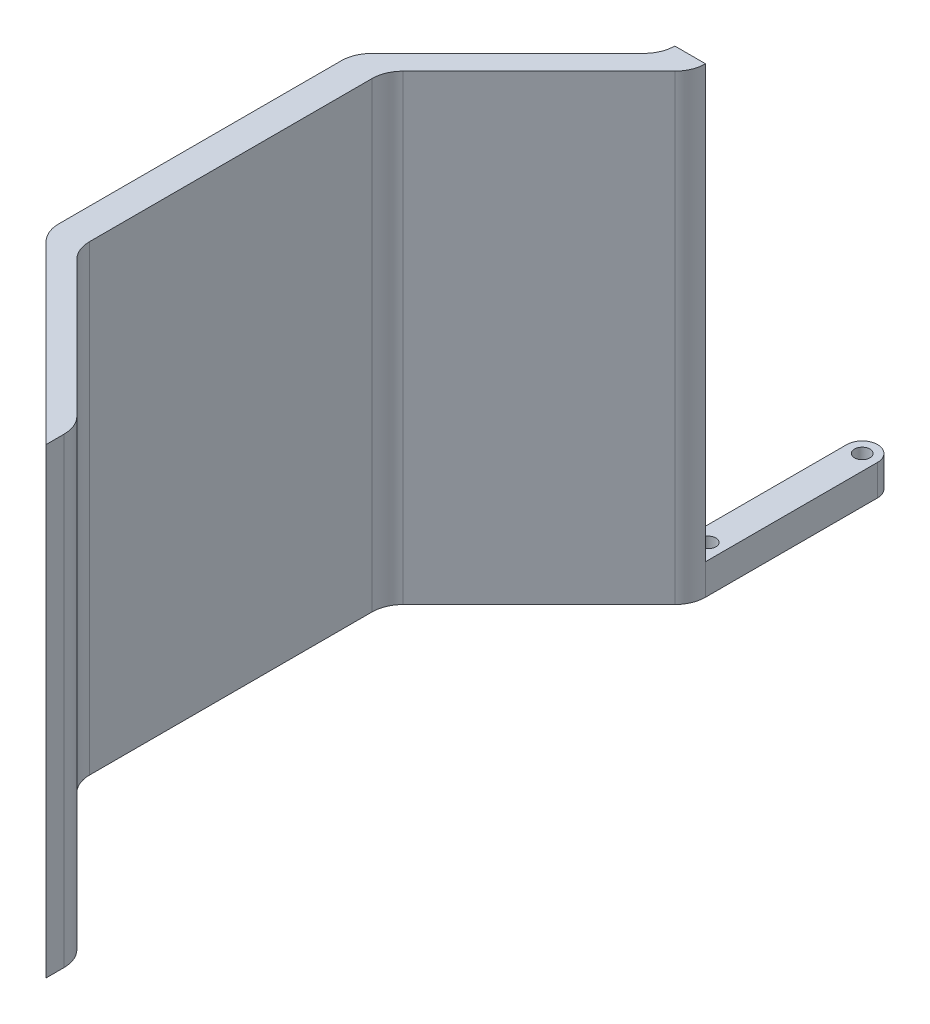
ISO-10303-21;
HEADER;
FILE_DESCRIPTION(('STEP AP214'),'2;1');
FILE_NAME('part.step','',(''),(''),'','','');
FILE_SCHEMA(('AUTOMOTIVE_DESIGN { 1 0 10303 214 1 1 1 1 }'));
ENDSEC;
DATA;
#1=APPLICATION_CONTEXT('core data for automotive mechanical design processes');
#2=APPLICATION_PROTOCOL_DEFINITION('international standard','automotive_design',2000,#1);
#3=PRODUCT_CONTEXT('',#1,'mechanical');
#4=PRODUCT('Part','Part','',(#3));
#5=PRODUCT_RELATED_PRODUCT_CATEGORY('part','',(#4));
#6=PRODUCT_DEFINITION_FORMATION('','',#4);
#7=PRODUCT_DEFINITION_CONTEXT('part definition',#1,'design');
#8=PRODUCT_DEFINITION('design','',#6,#7);
#9=PRODUCT_DEFINITION_SHAPE('','',#8);
#10=(LENGTH_UNIT() NAMED_UNIT(*) SI_UNIT(.MILLI.,.METRE.));
#11=(NAMED_UNIT(*) PLANE_ANGLE_UNIT() SI_UNIT($,.RADIAN.));
#12=(NAMED_UNIT(*) SI_UNIT($,.STERADIAN.) SOLID_ANGLE_UNIT());
#13=UNCERTAINTY_MEASURE_WITH_UNIT(LENGTH_MEASURE(1.E-05),#10,'distance_accuracy_value','');
#14=(GEOMETRIC_REPRESENTATION_CONTEXT(3) GLOBAL_UNCERTAINTY_ASSIGNED_CONTEXT((#13)) GLOBAL_UNIT_ASSIGNED_CONTEXT((#10,
#11,#12)) REPRESENTATION_CONTEXT('',''));
#15=CARTESIAN_POINT('',(0.,0.,0.));
#16=DIRECTION('',(0.,0.,1.));
#17=DIRECTION('',(1.,0.,0.));
#18=AXIS2_PLACEMENT_3D('',#15,#16,#17);
#19=CARTESIAN_POINT('',(-78.9293710518805,150.,-45.9986158011053));
#20=DIRECTION('',(0.,-1.,0.));
#21=DIRECTION('',(0.,0.,-1.));
#22=AXIS2_PLACEMENT_3D('',#19,#20,#21);
#23=CYLINDRICAL_SURFACE('',#22,5.);
#24=DIRECTION('',(0.,-1.,0.));
#25=VECTOR('',#24,1.);
#26=CARTESIAN_POINT('',(-83.9293710518805,150.,-45.9986158011053));
#27=LINE('',#26,#25);
#28=CARTESIAN_POINT('',(-83.9293710518805,9.99999999999998,-45.9986158011053));
#29=VERTEX_POINT('',#28);
#30=CARTESIAN_POINT('',(-83.9293710518805,0.,-45.9986158011053));
#31=VERTEX_POINT('',#30);
#32=EDGE_CURVE('E11',#29,#31,#27,.T.);
#33=ORIENTED_EDGE('',*,*,#32,.F.);
#34=CARTESIAN_POINT('',(-78.9293710518805,9.99999999999998,-45.9986158011053));
#35=DIRECTION('',(0.,1.,0.));
#36=DIRECTION('',(0.,0.,1.));
#37=AXIS2_PLACEMENT_3D('',#34,#35,#36);
#38=CIRCLE('',#37,5.);
#39=CARTESIAN_POINT('',(-73.9293710518805,9.99999999999998,-45.9986158011053));
#40=VERTEX_POINT('',#39);
#41=EDGE_CURVE('E204',#40,#29,#38,.T.);
#42=ORIENTED_EDGE('',*,*,#41,.F.);
#43=DIRECTION('',(0.,-1.,0.));
#44=VECTOR('',#43,1.);
#45=CARTESIAN_POINT('',(-73.9293710518805,150.,-45.9986158011053));
#46=LINE('',#45,#44);
#47=CARTESIAN_POINT('',(-73.9293710518805,0.,-45.9986158011053));
#48=VERTEX_POINT('',#47);
#49=EDGE_CURVE('E121',#40,#48,#46,.T.);
#50=ORIENTED_EDGE('',*,*,#49,.T.);
#51=CARTESIAN_POINT('',(-78.9293710518805,0.,-45.9986158011053));
#52=DIRECTION('',(0.,1.,0.));
#53=DIRECTION('',(0.,0.,1.));
#54=AXIS2_PLACEMENT_3D('',#51,#52,#53);
#55=CIRCLE('',#54,5.);
#56=EDGE_CURVE('E201',#31,#48,#55,.F.);
#57=ORIENTED_EDGE('',*,*,#56,.F.);
#58=EDGE_LOOP('',(#33,#42,#50,#57));
#59=FACE_BOUND('',#58,.T.);
#60=ADVANCED_FACE('F39',(#59),#23,.T.);
#61=CARTESIAN_POINT('',(-83.9293710518805,150.,0.));
#62=DIRECTION('',(1.,0.,0.));
#63=DIRECTION('',(0.,0.,-1.));
#64=AXIS2_PLACEMENT_3D('',#61,#62,#63);
#65=PLANE('',#64);
#66=DIRECTION('',(0.,0.,1.));
#67=VECTOR('',#66,1.);
#68=CARTESIAN_POINT('',(-83.9293710518805,9.99999999999998,-45.9986158011053));
#69=LINE('',#68,#67);
#70=CARTESIAN_POINT('',(-83.9293710518805,9.99999999999998,9.85924857516368));
#71=VERTEX_POINT('',#70);
#72=EDGE_CURVE('E290',#29,#71,#69,.T.);
#73=ORIENTED_EDGE('',*,*,#72,.F.);
#74=ORIENTED_EDGE('',*,*,#32,.T.);
#75=DIRECTION('',(0.,0.,1.));
#76=VECTOR('',#75,1.);
#77=CARTESIAN_POINT('',(-83.9293710518805,0.,0.));
#78=LINE('',#77,#76);
#79=CARTESIAN_POINT('',(-83.9293710518805,0.,9.85924857516368));
#80=VERTEX_POINT('',#79);
#81=EDGE_CURVE('E203',#31,#80,#78,.T.);
#82=ORIENTED_EDGE('',*,*,#81,.T.);
#83=DIRECTION('',(0.,-1.,0.));
#84=VECTOR('',#83,1.);
#85=CARTESIAN_POINT('',(-83.9293710518805,150.,9.85924857516368));
#86=LINE('',#85,#84);
#87=EDGE_CURVE('E274',#71,#80,#86,.T.);
#88=ORIENTED_EDGE('',*,*,#87,.F.);
#89=EDGE_LOOP('',(#73,#74,#82,#88));
#90=FACE_BOUND('',#89,.T.);
#91=ADVANCED_FACE('F348',(#90),#65,.F.);
#92=CARTESIAN_POINT('',(-73.9293710518805,150.,-3.50290159799378E-13));
#93=DIRECTION('',(1.,0.,0.));
#94=DIRECTION('',(0.,0.,-1.));
#95=AXIS2_PLACEMENT_3D('',#92,#93,#94);
#96=PLANE('',#95);
#97=ORIENTED_EDGE('',*,*,#49,.F.);
#98=DIRECTION('',(0.,0.,-1.));
#99=VECTOR('',#98,1.);
#100=CARTESIAN_POINT('',(-73.9293710518805,9.99999999999998,9.85924857516374));
#101=LINE('',#100,#99);
#102=CARTESIAN_POINT('',(-73.9293710518805,9.99999999999998,9.85924857516374));
#103=VERTEX_POINT('',#102);
#104=EDGE_CURVE('E296',#103,#40,#101,.T.);
#105=ORIENTED_EDGE('',*,*,#104,.F.);
#106=DIRECTION('',(0.,-1.,0.));
#107=VECTOR('',#106,1.);
#108=CARTESIAN_POINT('',(-73.9293710518805,150.,9.85924857516374));
#109=LINE('',#108,#107);
#110=CARTESIAN_POINT('',(-73.9293710518805,0.,9.85924857516374));
#111=VERTEX_POINT('',#110);
#112=EDGE_CURVE('E113',#103,#111,#109,.T.);
#113=ORIENTED_EDGE('',*,*,#112,.T.);
#114=DIRECTION('',(0.,0.,1.));
#115=VECTOR('',#114,1.);
#116=CARTESIAN_POINT('',(-73.9293710518805,0.,-3.50290159799378E-13));
#117=LINE('',#116,#115);
#118=EDGE_CURVE('E239',#48,#111,#117,.T.);
#119=ORIENTED_EDGE('',*,*,#118,.F.);
#120=EDGE_LOOP('',(#97,#105,#113,#119));
#121=FACE_BOUND('',#120,.T.);
#122=ADVANCED_FACE('F343',(#121),#96,.T.);
#123=CARTESIAN_POINT('',(-93.9293710518805,150.,9.85924857516369));
#124=DIRECTION('',(0.,-1.,0.));
#125=DIRECTION('',(0.,0.,-1.));
#126=AXIS2_PLACEMENT_3D('',#123,#124,#125);
#127=CYLINDRICAL_SURFACE('',#126,10.);
#128=CARTESIAN_POINT('',(-93.9293710518805,0.,9.85924857516369));
#129=DIRECTION('',(0.,1.,0.));
#130=DIRECTION('',(0.,0.,1.));
#131=AXIS2_PLACEMENT_3D('',#128,#129,#130);
#132=CIRCLE('',#131,10.);
#133=CARTESIAN_POINT('',(-86.8583032400151,0.,16.9303163870293));
#134=VERTEX_POINT('',#133);
#135=EDGE_CURVE('E207',#134,#80,#132,.T.);
#136=ORIENTED_EDGE('',*,*,#135,.F.);
#137=DIRECTION('',(0.,-1.,0.));
#138=VECTOR('',#137,1.);
#139=CARTESIAN_POINT('',(-86.8583032400151,150.,16.9303163870293));
#140=LINE('',#139,#138);
#141=CARTESIAN_POINT('',(-86.8583032400151,150.,16.9303163870293));
#142=VERTEX_POINT('',#141);
#143=EDGE_CURVE('E272',#142,#134,#140,.T.);
#144=ORIENTED_EDGE('',*,*,#143,.F.);
#145=CARTESIAN_POINT('',(-93.9293710518805,150.,9.85924857516369));
#146=DIRECTION('',(0.,1.,0.));
#147=DIRECTION('',(0.,0.,1.));
#148=AXIS2_PLACEMENT_3D('',#145,#146,#147);
#149=CIRCLE('',#148,10.);
#150=CARTESIAN_POINT('',(-83.9293710518805,150.,9.85924857516368));
#151=VERTEX_POINT('',#150);
#152=EDGE_CURVE('E242',#142,#151,#149,.T.);
#153=ORIENTED_EDGE('',*,*,#152,.T.);
#154=EDGE_CURVE('E48',#151,#71,#86,.T.);
#155=ORIENTED_EDGE('',*,*,#154,.T.);
#156=ORIENTED_EDGE('',*,*,#87,.T.);
#157=EDGE_LOOP('',(#136,#144,#153,#155,#156));
#158=FACE_BOUND('',#157,.T.);
#159=ADVANCED_FACE('F354',(#158),#127,.F.);
#160=CARTESIAN_POINT('',(-34.9639934264919,150.,-34.9639934264927));
#161=DIRECTION('',(0.707106781186539,0.,0.707106781186556));
#162=DIRECTION('',(0.707106781186556,0.,-0.707106781186539));
#163=AXIS2_PLACEMENT_3D('',#160,#161,#162);
#164=PLANE('',#163);
#165=DIRECTION('',(-0.707106781186556,0.,0.707106781186539));
#166=VECTOR('',#165,1.);
#167=CARTESIAN_POINT('',(-34.9639934264919,0.,-34.9639934264927));
#168=LINE('',#167,#166);
#169=CARTESIAN_POINT('',(-131.000438863747,0.,61.0724520107602));
#170=VERTEX_POINT('',#169);
#171=EDGE_CURVE('E210',#134,#170,#168,.T.);
#172=ORIENTED_EDGE('',*,*,#171,.T.);
#173=DIRECTION('',(0.,-1.,0.));
#174=VECTOR('',#173,1.);
#175=CARTESIAN_POINT('',(-131.000438863747,150.,61.0724520107602));
#176=LINE('',#175,#174);
#177=CARTESIAN_POINT('',(-131.000438863747,150.,61.0724520107602));
#178=VERTEX_POINT('',#177);
#179=EDGE_CURVE('E269',#178,#170,#176,.T.);
#180=ORIENTED_EDGE('',*,*,#179,.F.);
#181=DIRECTION('',(-0.707106781186556,0.,0.707106781186539));
#182=VECTOR('',#181,1.);
#183=CARTESIAN_POINT('',(-34.9639934264919,150.,-34.9639934264927));
#184=LINE('',#183,#182);
#185=EDGE_CURVE('E304',#142,#178,#184,.T.);
#186=ORIENTED_EDGE('',*,*,#185,.F.);
#187=ORIENTED_EDGE('',*,*,#143,.T.);
#188=EDGE_LOOP('',(#172,#180,#186,#187));
#189=FACE_BOUND('',#188,.T.);
#190=ADVANCED_FACE('F360',(#189),#164,.F.);
#191=CARTESIAN_POINT('',(-123.92937105188,150.,68.1435198226257));
#192=DIRECTION('',(0.,-1.,0.));
#193=DIRECTION('',(0.,0.,-1.));
#194=AXIS2_PLACEMENT_3D('',#191,#192,#193);
#195=CYLINDRICAL_SURFACE('',#194,10.000000000001);
#196=CARTESIAN_POINT('',(-123.92937105188,0.,68.1435198226257));
#197=DIRECTION('',(0.,1.,0.));
#198=DIRECTION('',(0.,0.,1.));
#199=AXIS2_PLACEMENT_3D('',#196,#197,#198);
#200=CIRCLE('',#199,10.000000000001);
#201=CARTESIAN_POINT('',(-133.929371051882,0.,68.1435198226258));
#202=VERTEX_POINT('',#201);
#203=EDGE_CURVE('E212',#170,#202,#200,.T.);
#204=ORIENTED_EDGE('',*,*,#203,.T.);
#205=DIRECTION('',(0.,-1.,0.));
#206=VECTOR('',#205,1.);
#207=CARTESIAN_POINT('',(-133.929371051882,150.,68.1435198226258));
#208=LINE('',#207,#206);
#209=CARTESIAN_POINT('',(-133.929371051882,150.,68.1435198226258));
#210=VERTEX_POINT('',#209);
#211=EDGE_CURVE('E266',#210,#202,#208,.T.);
#212=ORIENTED_EDGE('',*,*,#211,.F.);
#213=CARTESIAN_POINT('',(-123.92937105188,150.,68.1435198226257));
#214=DIRECTION('',(0.,1.,0.));
#215=DIRECTION('',(0.,0.,1.));
#216=AXIS2_PLACEMENT_3D('',#213,#214,#215);
#217=CIRCLE('',#216,10.000000000001);
#218=EDGE_CURVE('E306',#178,#210,#217,.T.);
#219=ORIENTED_EDGE('',*,*,#218,.F.);
#220=ORIENTED_EDGE('',*,*,#179,.T.);
#221=EDGE_LOOP('',(#204,#212,#219,#220));
#222=FACE_BOUND('',#221,.T.);
#223=ADVANCED_FACE('F362',(#222),#195,.T.);
#224=CARTESIAN_POINT('',(-133.929371051882,150.,0.));
#225=DIRECTION('',(1.,0.,0.));
#226=DIRECTION('',(0.,0.,-1.));
#227=AXIS2_PLACEMENT_3D('',#224,#225,#226);
#228=PLANE('',#227);
#229=DIRECTION('',(0.,0.,1.));
#230=VECTOR('',#229,1.);
#231=CARTESIAN_POINT('',(-133.929371051882,0.,0.));
#232=LINE('',#231,#230);
#233=CARTESIAN_POINT('',(-133.929371051882,0.,159.859248575164));
#234=VERTEX_POINT('',#233);
#235=EDGE_CURVE('E214',#202,#234,#232,.T.);
#236=ORIENTED_EDGE('',*,*,#235,.T.);
#237=DIRECTION('',(0.,-1.,0.));
#238=VECTOR('',#237,1.);
#239=CARTESIAN_POINT('',(-133.929371051882,150.,159.859248575164));
#240=LINE('',#239,#238);
#241=CARTESIAN_POINT('',(-133.929371051882,150.,159.859248575164));
#242=VERTEX_POINT('',#241);
#243=EDGE_CURVE('E263',#242,#234,#240,.T.);
#244=ORIENTED_EDGE('',*,*,#243,.F.);
#245=DIRECTION('',(0.,0.,1.));
#246=VECTOR('',#245,1.);
#247=CARTESIAN_POINT('',(-133.929371051882,150.,0.));
#248=LINE('',#247,#246);
#249=EDGE_CURVE('E308',#210,#242,#248,.T.);
#250=ORIENTED_EDGE('',*,*,#249,.F.);
#251=ORIENTED_EDGE('',*,*,#211,.T.);
#252=EDGE_LOOP('',(#236,#244,#250,#251));
#253=FACE_BOUND('',#252,.T.);
#254=ADVANCED_FACE('F367',(#253),#228,.F.);
#255=CARTESIAN_POINT('',(-123.929371051882,150.,159.859248575164));
#256=DIRECTION('',(0.,-1.,0.));
#257=DIRECTION('',(0.,0.,-1.));
#258=AXIS2_PLACEMENT_3D('',#255,#256,#257);
#259=CYLINDRICAL_SURFACE('',#258,10.);
#260=CARTESIAN_POINT('',(-123.929371051882,0.,159.859248575164));
#261=DIRECTION('',(0.,1.,0.));
#262=DIRECTION('',(0.,0.,1.));
#263=AXIS2_PLACEMENT_3D('',#260,#261,#262);
#264=CIRCLE('',#263,10.);
#265=CARTESIAN_POINT('',(-131.000438863747,0.,166.930316387029));
#266=VERTEX_POINT('',#265);
#267=EDGE_CURVE('E216',#234,#266,#264,.T.);
#268=ORIENTED_EDGE('',*,*,#267,.T.);
#269=DIRECTION('',(0.,-1.,0.));
#270=VECTOR('',#269,1.);
#271=CARTESIAN_POINT('',(-131.000438863747,150.,166.930316387029));
#272=LINE('',#271,#270);
#273=CARTESIAN_POINT('',(-131.000438863747,150.,166.930316387029));
#274=VERTEX_POINT('',#273);
#275=EDGE_CURVE('E260',#274,#266,#272,.T.);
#276=ORIENTED_EDGE('',*,*,#275,.F.);
#277=CARTESIAN_POINT('',(-123.929371051882,150.,159.859248575164));
#278=DIRECTION('',(0.,1.,0.));
#279=DIRECTION('',(0.,0.,1.));
#280=AXIS2_PLACEMENT_3D('',#277,#278,#279);
#281=CIRCLE('',#280,10.);
#282=EDGE_CURVE('E310',#242,#274,#281,.T.);
#283=ORIENTED_EDGE('',*,*,#282,.F.);
#284=ORIENTED_EDGE('',*,*,#243,.T.);
#285=EDGE_LOOP('',(#268,#276,#283,#284));
#286=FACE_BOUND('',#285,.T.);
#287=ADVANCED_FACE('F373',(#286),#259,.T.);
#288=CARTESIAN_POINT('',(-148.96537762539,150.,148.965377625386));
#289=DIRECTION('',(0.707106781186556,0.,-0.707106781186539));
#290=DIRECTION('',(-0.707106781186539,0.,-0.707106781186556));
#291=AXIS2_PLACEMENT_3D('',#288,#289,#290);
#292=PLANE('',#291);
#293=DIRECTION('',(0.707106781186539,0.,0.707106781186556));
#294=VECTOR('',#293,1.);
#295=CARTESIAN_POINT('',(-148.96537762539,0.,148.965377625386));
#296=LINE('',#295,#294);
#297=CARTESIAN_POINT('',(-73.9293710518805,0.,224.001384198897));
#298=VERTEX_POINT('',#297);
#299=EDGE_CURVE('E218',#266,#298,#296,.T.);
#300=ORIENTED_EDGE('',*,*,#299,.T.);
#301=DIRECTION('',(0.,-1.,0.));
#302=VECTOR('',#301,1.);
#303=CARTESIAN_POINT('',(-73.9293710518805,150.,224.001384198897));
#304=LINE('',#303,#302);
#305=CARTESIAN_POINT('',(-73.9293710518805,150.,224.001384198897));
#306=VERTEX_POINT('',#305);
#307=EDGE_CURVE('E257',#306,#298,#304,.T.);
#308=ORIENTED_EDGE('',*,*,#307,.F.);
#309=DIRECTION('',(0.707106781186539,0.,0.707106781186556));
#310=VECTOR('',#309,1.);
#311=CARTESIAN_POINT('',(-148.96537762539,150.,148.965377625386));
#312=LINE('',#311,#310);
#313=EDGE_CURVE('E312',#274,#306,#312,.T.);
#314=ORIENTED_EDGE('',*,*,#313,.F.);
#315=ORIENTED_EDGE('',*,*,#275,.T.);
#316=EDGE_LOOP('',(#300,#308,#314,#315));
#317=FACE_BOUND('',#316,.T.);
#318=ADVANCED_FACE('F377',(#317),#292,.F.);
#319=CARTESIAN_POINT('',(-73.9293710518805,150.,0.));
#320=DIRECTION('',(-1.,0.,0.));
#321=DIRECTION('',(0.,0.,1.));
#322=AXIS2_PLACEMENT_3D('',#319,#320,#321);
#323=PLANE('',#322);
#324=DIRECTION('',(0.,0.,-1.));
#325=VECTOR('',#324,1.);
#326=CARTESIAN_POINT('',(-73.9293710518805,0.,0.));
#327=LINE('',#326,#325);
#328=CARTESIAN_POINT('',(-73.9293710518805,0.,218.143519822626));
#329=VERTEX_POINT('',#328);
#330=EDGE_CURVE('E220',#298,#329,#327,.T.);
#331=ORIENTED_EDGE('',*,*,#330,.T.);
#332=DIRECTION('',(0.,-1.,0.));
#333=VECTOR('',#332,1.);
#334=CARTESIAN_POINT('',(-73.9293710518805,150.,218.143519822626));
#335=LINE('',#334,#333);
#336=CARTESIAN_POINT('',(-73.9293710518805,150.,218.143519822626));
#337=VERTEX_POINT('',#336);
#338=EDGE_CURVE('E254',#337,#329,#335,.T.);
#339=ORIENTED_EDGE('',*,*,#338,.F.);
#340=DIRECTION('',(0.,0.,-1.));
#341=VECTOR('',#340,1.);
#342=CARTESIAN_POINT('',(-73.9293710518805,150.,0.));
#343=LINE('',#342,#341);
#344=EDGE_CURVE('E314',#306,#337,#343,.T.);
#345=ORIENTED_EDGE('',*,*,#344,.F.);
#346=ORIENTED_EDGE('',*,*,#307,.T.);
#347=EDGE_LOOP('',(#331,#339,#345,#346));
#348=FACE_BOUND('',#347,.T.);
#349=ADVANCED_FACE('F382',(#348),#323,.F.);
#350=CARTESIAN_POINT('',(-83.9293710518805,150.,218.143519822626));
#351=DIRECTION('',(0.,-1.,0.));
#352=DIRECTION('',(0.,0.,-1.));
#353=AXIS2_PLACEMENT_3D('',#350,#351,#352);
#354=CYLINDRICAL_SURFACE('',#353,10.0000000000004);
#355=CARTESIAN_POINT('',(-83.9293710518805,0.,218.143519822626));
#356=DIRECTION('',(0.,1.,0.));
#357=DIRECTION('',(0.,0.,1.));
#358=AXIS2_PLACEMENT_3D('',#355,#356,#357);
#359=CIRCLE('',#358,10.0000000000004);
#360=CARTESIAN_POINT('',(-76.8583032400141,0.,211.07245201076));
#361=VERTEX_POINT('',#360);
#362=EDGE_CURVE('E222',#329,#361,#359,.T.);
#363=ORIENTED_EDGE('',*,*,#362,.T.);
#364=DIRECTION('',(0.,-1.,0.));
#365=VECTOR('',#364,1.);
#366=CARTESIAN_POINT('',(-76.8583032400141,150.,211.07245201076));
#367=LINE('',#366,#365);
#368=CARTESIAN_POINT('',(-76.8583032400141,150.,211.07245201076));
#369=VERTEX_POINT('',#368);
#370=EDGE_CURVE('E252',#369,#361,#367,.T.);
#371=ORIENTED_EDGE('',*,*,#370,.F.);
#372=CARTESIAN_POINT('',(-83.9293710518805,150.,218.143519822626));
#373=DIRECTION('',(0.,1.,0.));
#374=DIRECTION('',(0.,0.,1.));
#375=AXIS2_PLACEMENT_3D('',#372,#373,#374);
#376=CIRCLE('',#375,10.0000000000004);
#377=EDGE_CURVE('E316',#337,#369,#376,.T.);
#378=ORIENTED_EDGE('',*,*,#377,.F.);
#379=ORIENTED_EDGE('',*,*,#338,.T.);
#380=EDGE_LOOP('',(#363,#371,#378,#379));
#381=FACE_BOUND('',#380,.T.);
#382=ADVANCED_FACE('F385',(#381),#354,.T.);
#383=CARTESIAN_POINT('',(-143.965377625386,150.,143.965377625389));
#384=DIRECTION('',(0.70710678118654,0.,-0.707106781186555));
#385=DIRECTION('',(-0.707106781186555,0.,-0.70710678118654));
#386=AXIS2_PLACEMENT_3D('',#383,#384,#385);
#387=PLANE('',#386);
#388=DIRECTION('',(0.707106781186555,0.,0.70710678118654));
#389=VECTOR('',#388,1.);
#390=CARTESIAN_POINT('',(-143.965377625386,0.,143.965377625389));
#391=LINE('',#390,#389);
#392=CARTESIAN_POINT('',(-121.000438863746,0.,166.930316387029));
#393=VERTEX_POINT('',#392);
#394=EDGE_CURVE('E225',#393,#361,#391,.T.);
#395=ORIENTED_EDGE('',*,*,#394,.F.);
#396=DIRECTION('',(0.,-1.,0.));
#397=VECTOR('',#396,1.);
#398=CARTESIAN_POINT('',(-121.000438863746,150.,166.930316387029));
#399=LINE('',#398,#397);
#400=CARTESIAN_POINT('',(-121.000438863746,150.,166.930316387029));
#401=VERTEX_POINT('',#400);
#402=EDGE_CURVE('E250',#401,#393,#399,.T.);
#403=ORIENTED_EDGE('',*,*,#402,.F.);
#404=DIRECTION('',(0.707106781186555,0.,0.70710678118654));
#405=VECTOR('',#404,1.);
#406=CARTESIAN_POINT('',(-143.965377625386,150.,143.965377625389));
#407=LINE('',#406,#405);
#408=EDGE_CURVE('E193',#401,#369,#407,.T.);
#409=ORIENTED_EDGE('',*,*,#408,.T.);
#410=ORIENTED_EDGE('',*,*,#370,.T.);
#411=EDGE_LOOP('',(#395,#403,#409,#410));
#412=FACE_BOUND('',#411,.T.);
#413=ADVANCED_FACE('F320',(#412),#387,.T.);
#414=CARTESIAN_POINT('',(-113.929371051881,150.,159.859248575164));
#415=DIRECTION('',(0.,-1.,0.));
#416=DIRECTION('',(0.,0.,-1.));
#417=AXIS2_PLACEMENT_3D('',#414,#415,#416);
#418=CYLINDRICAL_SURFACE('',#417,10.0000000000006);
#419=CARTESIAN_POINT('',(-113.929371051881,0.,159.859248575164));
#420=DIRECTION('',(0.,1.,0.));
#421=DIRECTION('',(0.,0.,1.));
#422=AXIS2_PLACEMENT_3D('',#419,#420,#421);
#423=CIRCLE('',#422,10.0000000000006);
#424=CARTESIAN_POINT('',(-123.929371051882,0.,159.859248575164));
#425=VERTEX_POINT('',#424);
#426=EDGE_CURVE('E228',#425,#393,#423,.T.);
#427=ORIENTED_EDGE('',*,*,#426,.F.);
#428=DIRECTION('',(0.,-1.,0.));
#429=VECTOR('',#428,1.);
#430=CARTESIAN_POINT('',(-123.929371051882,150.,159.859248575164));
#431=LINE('',#430,#429);
#432=CARTESIAN_POINT('',(-123.929371051882,150.,159.859248575164));
#433=VERTEX_POINT('',#432);
#434=EDGE_CURVE('E177',#433,#425,#431,.T.);
#435=ORIENTED_EDGE('',*,*,#434,.F.);
#436=CARTESIAN_POINT('',(-113.929371051881,150.,159.859248575164));
#437=DIRECTION('',(0.,1.,0.));
#438=DIRECTION('',(0.,0.,1.));
#439=AXIS2_PLACEMENT_3D('',#436,#437,#438);
#440=CIRCLE('',#439,10.0000000000006);
#441=EDGE_CURVE('E191',#433,#401,#440,.T.);
#442=ORIENTED_EDGE('',*,*,#441,.T.);
#443=ORIENTED_EDGE('',*,*,#402,.T.);
#444=EDGE_LOOP('',(#427,#435,#442,#443));
#445=FACE_BOUND('',#444,.T.);
#446=ADVANCED_FACE('F325',(#445),#418,.F.);
#447=CARTESIAN_POINT('',(-123.92937105188,150.,-1.63143554335295E-12));
#448=DIRECTION('',(1.,0.,0.));
#449=DIRECTION('',(0.,0.,-1.));
#450=AXIS2_PLACEMENT_3D('',#447,#448,#449);
#451=PLANE('',#450);
#452=DIRECTION('',(0.,0.,1.));
#453=VECTOR('',#452,1.);
#454=CARTESIAN_POINT('',(-123.92937105188,0.,-1.63143554335295E-12));
#455=LINE('',#454,#453);
#456=CARTESIAN_POINT('',(-123.92937105188,0.,68.1435198226257));
#457=VERTEX_POINT('',#456);
#458=EDGE_CURVE('E173',#457,#425,#455,.T.);
#459=ORIENTED_EDGE('',*,*,#458,.F.);
#460=DIRECTION('',(0.,-1.,0.));
#461=VECTOR('',#460,1.);
#462=CARTESIAN_POINT('',(-123.92937105188,150.,68.1435198226257));
#463=LINE('',#462,#461);
#464=CARTESIAN_POINT('',(-123.92937105188,150.,68.1435198226257));
#465=VERTEX_POINT('',#464);
#466=EDGE_CURVE('E167',#465,#457,#463,.T.);
#467=ORIENTED_EDGE('',*,*,#466,.F.);
#468=DIRECTION('',(0.,0.,1.));
#469=VECTOR('',#468,1.);
#470=CARTESIAN_POINT('',(-123.92937105188,150.,-1.63143554335295E-12));
#471=LINE('',#470,#469);
#472=EDGE_CURVE('E171',#465,#433,#471,.T.);
#473=ORIENTED_EDGE('',*,*,#472,.T.);
#474=ORIENTED_EDGE('',*,*,#434,.T.);
#475=EDGE_LOOP('',(#459,#467,#473,#474));
#476=FACE_BOUND('',#475,.T.);
#477=ADVANCED_FACE('F169',(#476),#451,.T.);
#478=CARTESIAN_POINT('',(-113.929371051881,150.,68.1435198226257));
#479=DIRECTION('',(0.,-1.,0.));
#480=DIRECTION('',(0.,0.,-1.));
#481=AXIS2_PLACEMENT_3D('',#478,#479,#480);
#482=CYLINDRICAL_SURFACE('',#481,9.99999999999999);
#483=CARTESIAN_POINT('',(-113.929371051881,0.,68.1435198226257));
#484=DIRECTION('',(0.,1.,0.));
#485=DIRECTION('',(0.,0.,1.));
#486=AXIS2_PLACEMENT_3D('',#483,#484,#485);
#487=CIRCLE('',#486,9.99999999999999);
#488=CARTESIAN_POINT('',(-121.000438863746,0.,61.0724520107602));
#489=VERTEX_POINT('',#488);
#490=EDGE_CURVE('E232',#457,#489,#487,.F.);
#491=ORIENTED_EDGE('',*,*,#490,.T.);
#492=DIRECTION('',(0.,-1.,0.));
#493=VECTOR('',#492,1.);
#494=CARTESIAN_POINT('',(-121.000438863746,150.,61.0724520107602));
#495=LINE('',#494,#493);
#496=CARTESIAN_POINT('',(-121.000438863746,150.,61.0724520107602));
#497=VERTEX_POINT('',#496);
#498=EDGE_CURVE('E178',#497,#489,#495,.T.);
#499=ORIENTED_EDGE('',*,*,#498,.F.);
#500=CARTESIAN_POINT('',(-113.929371051881,150.,68.1435198226257));
#501=DIRECTION('',(0.,1.,0.));
#502=DIRECTION('',(0.,0.,1.));
#503=AXIS2_PLACEMENT_3D('',#500,#501,#502);
#504=CIRCLE('',#503,9.99999999999999);
#505=EDGE_CURVE('E181',#465,#497,#504,.F.);
#506=ORIENTED_EDGE('',*,*,#505,.F.);
#507=ORIENTED_EDGE('',*,*,#466,.T.);
#508=EDGE_LOOP('',(#491,#499,#506,#507));
#509=FACE_BOUND('',#508,.T.);
#510=ADVANCED_FACE('F182',(#509),#482,.F.);
#511=CARTESIAN_POINT('',(-29.9639934264929,150.,-29.9639934264929));
#512=DIRECTION('',(0.707106781186548,0.,0.707106781186547));
#513=DIRECTION('',(0.707106781186547,0.,-0.707106781186548));
#514=AXIS2_PLACEMENT_3D('',#511,#512,#513);
#515=PLANE('',#514);
#516=DIRECTION('',(-0.707106781186547,0.,0.707106781186548));
#517=VECTOR('',#516,1.);
#518=CARTESIAN_POINT('',(-29.9639934264929,0.,-29.9639934264929));
#519=LINE('',#518,#517);
#520=CARTESIAN_POINT('',(-76.8583032400151,0.,16.9303163870293));
#521=VERTEX_POINT('',#520);
#522=EDGE_CURVE('E234',#521,#489,#519,.T.);
#523=ORIENTED_EDGE('',*,*,#522,.F.);
#524=DIRECTION('',(0.,-1.,0.));
#525=VECTOR('',#524,1.);
#526=CARTESIAN_POINT('',(-76.8583032400151,150.,16.9303163870293));
#527=LINE('',#526,#525);
#528=CARTESIAN_POINT('',(-76.8583032400151,150.,16.9303163870293));
#529=VERTEX_POINT('',#528);
#530=EDGE_CURVE('E57',#529,#521,#527,.T.);
#531=ORIENTED_EDGE('',*,*,#530,.F.);
#532=DIRECTION('',(-0.707106781186547,0.,0.707106781186548));
#533=VECTOR('',#532,1.);
#534=CARTESIAN_POINT('',(-29.9639934264929,150.,-29.9639934264929));
#535=LINE('',#534,#533);
#536=EDGE_CURVE('E185',#529,#497,#535,.T.);
#537=ORIENTED_EDGE('',*,*,#536,.T.);
#538=ORIENTED_EDGE('',*,*,#498,.T.);
#539=EDGE_LOOP('',(#523,#531,#537,#538));
#540=FACE_BOUND('',#539,.T.);
#541=ADVANCED_FACE('F329',(#540),#515,.T.);
#542=CARTESIAN_POINT('',(-83.9293710518805,150.,9.85924857516368));
#543=DIRECTION('',(0.,-1.,0.));
#544=DIRECTION('',(0.,0.,-1.));
#545=AXIS2_PLACEMENT_3D('',#542,#543,#544);
#546=CYLINDRICAL_SURFACE('',#545,10.);
#547=CARTESIAN_POINT('',(-83.9293710518805,0.,9.85924857516368));
#548=DIRECTION('',(0.,1.,0.));
#549=DIRECTION('',(0.,0.,1.));
#550=AXIS2_PLACEMENT_3D('',#547,#548,#549);
#551=CIRCLE('',#550,10.);
#552=EDGE_CURVE('E237',#521,#111,#551,.T.);
#553=ORIENTED_EDGE('',*,*,#552,.T.);
#554=ORIENTED_EDGE('',*,*,#112,.F.);
#555=CARTESIAN_POINT('',(-73.9293710518805,150.,9.85924857516374));
#556=VERTEX_POINT('',#555);
#557=EDGE_CURVE('E244',#556,#103,#109,.T.);
#558=ORIENTED_EDGE('',*,*,#557,.F.);
#559=CARTESIAN_POINT('',(-83.9293710518805,150.,9.85924857516368));
#560=DIRECTION('',(0.,1.,0.));
#561=DIRECTION('',(0.,0.,1.));
#562=AXIS2_PLACEMENT_3D('',#559,#560,#561);
#563=CIRCLE('',#562,10.);
#564=EDGE_CURVE('E198',#529,#556,#563,.T.);
#565=ORIENTED_EDGE('',*,*,#564,.F.);
#566=ORIENTED_EDGE('',*,*,#530,.T.);
#567=EDGE_LOOP('',(#553,#554,#558,#565,#566));
#568=FACE_BOUND('',#567,.T.);
#569=ADVANCED_FACE('F334',(#568),#546,.T.);
#570=CARTESIAN_POINT('',(0.,150.,0.));
#571=DIRECTION('',(0.,1.,0.));
#572=DIRECTION('',(0.,0.,1.));
#573=AXIS2_PLACEMENT_3D('',#570,#571,#572);
#574=PLANE('',#573);
#575=DIRECTION('',(1.,0.,0.));
#576=VECTOR('',#575,1.);
#577=CARTESIAN_POINT('',(-83.9293710518805,150.,9.85924857516368));
#578=LINE('',#577,#576);
#579=EDGE_CURVE('E281',#151,#556,#578,.T.);
#580=ORIENTED_EDGE('',*,*,#579,.F.);
#581=ORIENTED_EDGE('',*,*,#152,.F.);
#582=ORIENTED_EDGE('',*,*,#185,.T.);
#583=ORIENTED_EDGE('',*,*,#218,.T.);
#584=ORIENTED_EDGE('',*,*,#249,.T.);
#585=ORIENTED_EDGE('',*,*,#282,.T.);
#586=ORIENTED_EDGE('',*,*,#313,.T.);
#587=ORIENTED_EDGE('',*,*,#344,.T.);
#588=ORIENTED_EDGE('',*,*,#377,.T.);
#589=ORIENTED_EDGE('',*,*,#408,.F.);
#590=ORIENTED_EDGE('',*,*,#441,.F.);
#591=ORIENTED_EDGE('',*,*,#472,.F.);
#592=ORIENTED_EDGE('',*,*,#505,.T.);
#593=ORIENTED_EDGE('',*,*,#536,.F.);
#594=ORIENTED_EDGE('',*,*,#564,.T.);
#595=EDGE_LOOP('',(#580,#581,#582,#583,#584,#585,#586,#587,#588,#589,#590,#591,#592,#593,#594));
#596=FACE_BOUND('',#595,.T.);
#597=ADVANCED_FACE('F188',(#596),#574,.T.);
#598=CARTESIAN_POINT('',(0.,0.,0.));
#599=DIRECTION('',(0.,1.,0.));
#600=DIRECTION('',(0.,0.,1.));
#601=AXIS2_PLACEMENT_3D('',#598,#599,#600);
#602=PLANE('',#601);
#603=CARTESIAN_POINT('',(-78.9293710518805,0.,-45.9986158011053));
#604=DIRECTION('',(0.,-1.,0.));
#605=DIRECTION('',(0.,0.,-1.));
#606=AXIS2_PLACEMENT_3D('',#603,#604,#605);
#607=CIRCLE('',#606,2.5);
#608=CARTESIAN_POINT('',(-78.9293710518805,0.,-48.4986158011053));
#609=VERTEX_POINT('',#608);
#610=EDGE_CURVE('E277',#609,#609,#607,.T.);
#611=ORIENTED_EDGE('',*,*,#610,.F.);
#612=EDGE_LOOP('',(#611));
#613=FACE_BOUND('',#612,.T.);
#614=CARTESIAN_POINT('',(-78.9293710518805,0.,4.00138419889474));
#615=DIRECTION('',(0.,-1.,0.));
#616=DIRECTION('',(0.,0.,-1.));
#617=AXIS2_PLACEMENT_3D('',#614,#615,#616);
#618=CIRCLE('',#617,2.5);
#619=CARTESIAN_POINT('',(-78.9293710518805,0.,1.50138419889475));
#620=VERTEX_POINT('',#619);
#621=EDGE_CURVE('E283',#620,#620,#618,.T.);
#622=ORIENTED_EDGE('',*,*,#621,.F.);
#623=EDGE_LOOP('',(#622));
#624=FACE_BOUND('',#623,.T.);
#625=ORIENTED_EDGE('',*,*,#56,.T.);
#626=ORIENTED_EDGE('',*,*,#118,.T.);
#627=ORIENTED_EDGE('',*,*,#552,.F.);
#628=ORIENTED_EDGE('',*,*,#522,.T.);
#629=ORIENTED_EDGE('',*,*,#490,.F.);
#630=ORIENTED_EDGE('',*,*,#458,.T.);
#631=ORIENTED_EDGE('',*,*,#426,.T.);
#632=ORIENTED_EDGE('',*,*,#394,.T.);
#633=ORIENTED_EDGE('',*,*,#362,.F.);
#634=ORIENTED_EDGE('',*,*,#330,.F.);
#635=ORIENTED_EDGE('',*,*,#299,.F.);
#636=ORIENTED_EDGE('',*,*,#267,.F.);
#637=ORIENTED_EDGE('',*,*,#235,.F.);
#638=ORIENTED_EDGE('',*,*,#203,.F.);
#639=ORIENTED_EDGE('',*,*,#171,.F.);
#640=ORIENTED_EDGE('',*,*,#135,.T.);
#641=ORIENTED_EDGE('',*,*,#81,.F.);
#642=EDGE_LOOP('',(#625,#626,#627,#628,#629,#630,#631,#632,#633,#634,#635,#636,#637,#638,#639,
#640,#641));
#643=FACE_BOUND('',#642,.T.);
#644=ADVANCED_FACE('F327',(#613,#624,#643),#602,.F.);
#645=CARTESIAN_POINT('',(-83.9293710518805,9.99999999999998,9.85924857516368));
#646=DIRECTION('',(0.,0.,1.));
#647=DIRECTION('',(1.,0.,0.));
#648=AXIS2_PLACEMENT_3D('',#645,#646,#647);
#649=PLANE('',#648);
#650=ORIENTED_EDGE('',*,*,#579,.T.);
#651=ORIENTED_EDGE('',*,*,#557,.T.);
#652=DIRECTION('',(1.,0.,0.));
#653=VECTOR('',#652,1.);
#654=CARTESIAN_POINT('',(-83.9293710518805,9.99999999999998,9.85924857516368));
#655=LINE('',#654,#653);
#656=EDGE_CURVE('E293',#71,#103,#655,.T.);
#657=ORIENTED_EDGE('',*,*,#656,.F.);
#658=ORIENTED_EDGE('',*,*,#154,.F.);
#659=EDGE_LOOP('',(#650,#651,#657,#658));
#660=FACE_BOUND('',#659,.T.);
#661=ADVANCED_FACE('F336',(#660),#649,.F.);
#662=CARTESIAN_POINT('',(-78.9293710518805,9.99999999999998,-45.9986158011053));
#663=DIRECTION('',(0.,1.,0.));
#664=DIRECTION('',(0.,0.,1.));
#665=AXIS2_PLACEMENT_3D('',#662,#663,#664);
#666=PLANE('',#665);
#667=CARTESIAN_POINT('',(-78.9293710518805,9.99999999999998,-45.9986158011053));
#668=DIRECTION('',(0.,1.,0.));
#669=DIRECTION('',(0.,0.,1.));
#670=AXIS2_PLACEMENT_3D('',#667,#668,#669);
#671=CIRCLE('',#670,2.5);
#672=CARTESIAN_POINT('',(-78.9293710518805,9.99999999999998,-43.4986158011053));
#673=VERTEX_POINT('',#672);
#674=EDGE_CURVE('E42',#673,#673,#671,.T.);
#675=ORIENTED_EDGE('',*,*,#674,.F.);
#676=EDGE_LOOP('',(#675));
#677=FACE_BOUND('',#676,.T.);
#678=CARTESIAN_POINT('',(-78.9293710518805,9.99999999999998,4.00138419889474));
#679=DIRECTION('',(0.,1.,0.));
#680=DIRECTION('',(0.,0.,1.));
#681=AXIS2_PLACEMENT_3D('',#678,#679,#680);
#682=CIRCLE('',#681,2.5);
#683=CARTESIAN_POINT('',(-78.9293710518805,9.99999999999998,6.50138419889474));
#684=VERTEX_POINT('',#683);
#685=EDGE_CURVE('E275',#684,#684,#682,.T.);
#686=ORIENTED_EDGE('',*,*,#685,.F.);
#687=EDGE_LOOP('',(#686));
#688=FACE_BOUND('',#687,.T.);
#689=ORIENTED_EDGE('',*,*,#72,.T.);
#690=ORIENTED_EDGE('',*,*,#656,.T.);
#691=ORIENTED_EDGE('',*,*,#104,.T.);
#692=ORIENTED_EDGE('',*,*,#41,.T.);
#693=EDGE_LOOP('',(#689,#690,#691,#692));
#694=FACE_BOUND('',#693,.T.);
#695=ADVANCED_FACE('F340',(#677,#688,#694),#666,.T.);
#696=CARTESIAN_POINT('',(-78.9293710518805,150.,4.00138419889474));
#697=DIRECTION('',(0.,-1.,0.));
#698=DIRECTION('',(0.,0.,-1.));
#699=AXIS2_PLACEMENT_3D('',#696,#697,#698);
#700=CYLINDRICAL_SURFACE('',#699,2.5);
#701=ORIENTED_EDGE('',*,*,#685,.T.);
#702=EDGE_LOOP('',(#701));
#703=FACE_BOUND('',#702,.T.);
#704=ORIENTED_EDGE('',*,*,#621,.T.);
#705=EDGE_LOOP('',(#704));
#706=FACE_BOUND('',#705,.T.);
#707=ADVANCED_FACE('F527',(#703,#706),#700,.F.);
#708=CARTESIAN_POINT('',(-78.9293710518805,150.,-45.9986158011053));
#709=DIRECTION('',(0.,-1.,0.));
#710=DIRECTION('',(0.,0.,-1.));
#711=AXIS2_PLACEMENT_3D('',#708,#709,#710);
#712=CYLINDRICAL_SURFACE('',#711,2.5);
#713=ORIENTED_EDGE('',*,*,#674,.T.);
#714=EDGE_LOOP('',(#713));
#715=FACE_BOUND('',#714,.T.);
#716=ORIENTED_EDGE('',*,*,#610,.T.);
#717=EDGE_LOOP('',(#716));
#718=FACE_BOUND('',#717,.T.);
#719=ADVANCED_FACE('F537',(#715,#718),#712,.F.);
#720=CLOSED_SHELL('',(#60,#91,#122,#159,#190,#223,#254,#287,#318,#349,#382,#413,#446,#477,#510,
#541,#569,#597,#644,#661,#695,#707,#719));
#721=MANIFOLD_SOLID_BREP('B2',#720);
#722=ADVANCED_BREP_SHAPE_REPRESENTATION('',(#18,#721),#14);
#723=SHAPE_DEFINITION_REPRESENTATION(#9,#722);
ENDSEC;
END-ISO-10303-21;
